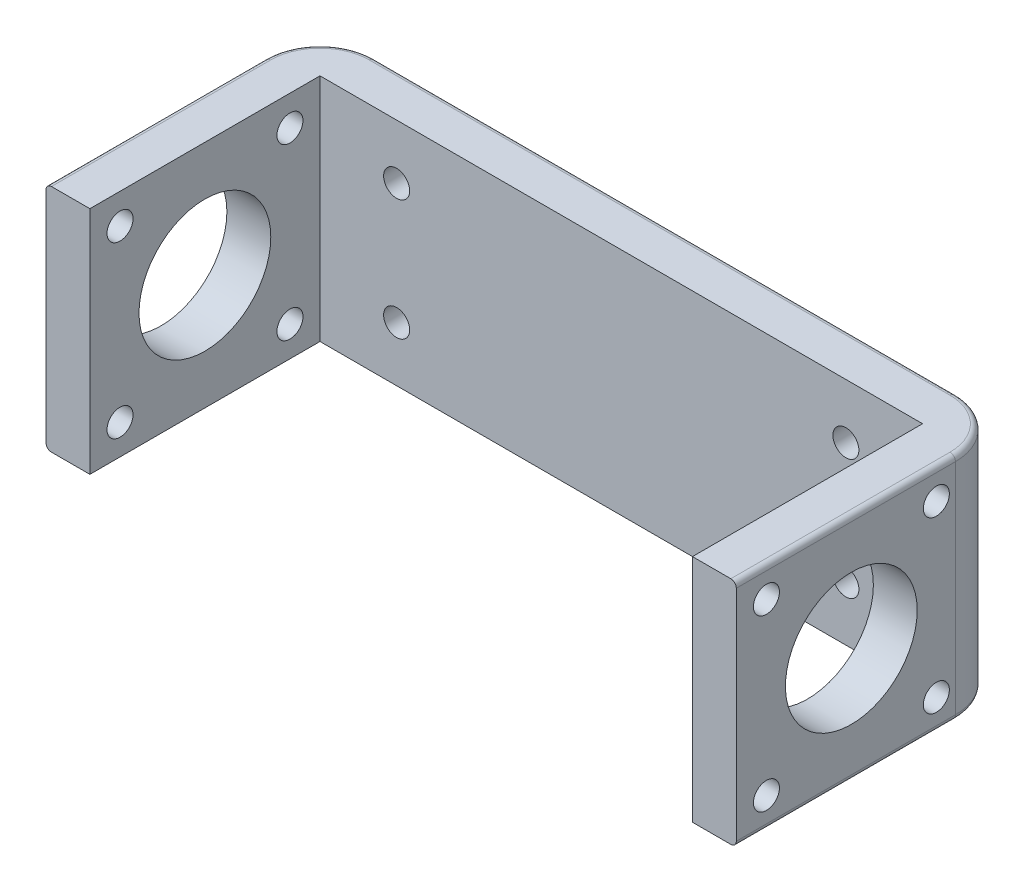
ISO-10303-21;
HEADER;
FILE_DESCRIPTION(('STEP AP214'),'2;1');
FILE_NAME('part.step','',(''),(''),'','','');
FILE_SCHEMA(('AUTOMOTIVE_DESIGN { 1 0 10303 214 1 1 1 1 }'));
ENDSEC;
DATA;
#1=APPLICATION_CONTEXT('core data for automotive mechanical design processes');
#2=APPLICATION_PROTOCOL_DEFINITION('international standard','automotive_design',2000,#1);
#3=PRODUCT_CONTEXT('',#1,'mechanical');
#4=PRODUCT('Part','Part','',(#3));
#5=PRODUCT_RELATED_PRODUCT_CATEGORY('part','',(#4));
#6=PRODUCT_DEFINITION_FORMATION('','',#4);
#7=PRODUCT_DEFINITION_CONTEXT('part definition',#1,'design');
#8=PRODUCT_DEFINITION('design','',#6,#7);
#9=PRODUCT_DEFINITION_SHAPE('','',#8);
#10=(LENGTH_UNIT() NAMED_UNIT(*) SI_UNIT(.MILLI.,.METRE.));
#11=(NAMED_UNIT(*) PLANE_ANGLE_UNIT() SI_UNIT($,.RADIAN.));
#12=(NAMED_UNIT(*) SI_UNIT($,.STERADIAN.) SOLID_ANGLE_UNIT());
#13=UNCERTAINTY_MEASURE_WITH_UNIT(LENGTH_MEASURE(1.E-05),#10,'distance_accuracy_value','');
#14=(GEOMETRIC_REPRESENTATION_CONTEXT(3) GLOBAL_UNCERTAINTY_ASSIGNED_CONTEXT((#13)) GLOBAL_UNIT_ASSIGNED_CONTEXT((#10,
#11,#12)) REPRESENTATION_CONTEXT('',''));
#15=CARTESIAN_POINT('',(0.,0.,0.));
#16=DIRECTION('',(0.,0.,1.));
#17=DIRECTION('',(1.,0.,0.));
#18=AXIS2_PLACEMENT_3D('',#15,#16,#17);
#19=CARTESIAN_POINT('',(0.,0.,8.));
#20=DIRECTION('',(0.,0.,1.));
#21=DIRECTION('',(1.,0.,0.));
#22=AXIS2_PLACEMENT_3D('',#19,#20,#21);
#23=PLANE('',#22);
#24=CARTESIAN_POINT('',(58.972972972973,-14.9328111570135,8.));
#25=DIRECTION('',(0.,0.,1.));
#26=DIRECTION('',(1.,0.,0.));
#27=AXIS2_PLACEMENT_3D('',#24,#25,#26);
#28=CIRCLE('',#27,2.375);
#29=CARTESIAN_POINT('',(61.347972972973,-14.9328111570135,8.));
#30=VERTEX_POINT('',#29);
#31=EDGE_CURVE('E284',#30,#30,#28,.T.);
#32=ORIENTED_EDGE('',*,*,#31,.F.);
#33=EDGE_LOOP('',(#32));
#34=FACE_BOUND('',#33,.T.);
#35=CARTESIAN_POINT('',(-23.027027027027,7.06718884298652,8.));
#36=DIRECTION('',(0.,0.,1.));
#37=DIRECTION('',(1.,0.,0.));
#38=AXIS2_PLACEMENT_3D('',#35,#36,#37);
#39=CIRCLE('',#38,2.375);
#40=CARTESIAN_POINT('',(-20.652027027027,7.06718884298652,8.));
#41=VERTEX_POINT('',#40);
#42=EDGE_CURVE('E329',#41,#41,#39,.T.);
#43=ORIENTED_EDGE('',*,*,#42,.F.);
#44=EDGE_LOOP('',(#43));
#45=FACE_BOUND('',#44,.T.);
#46=CARTESIAN_POINT('',(-23.027027027027,-14.9328111570135,8.));
#47=DIRECTION('',(0.,0.,1.));
#48=DIRECTION('',(1.,0.,0.));
#49=AXIS2_PLACEMENT_3D('',#46,#47,#48);
#50=CIRCLE('',#49,2.375);
#51=CARTESIAN_POINT('',(-20.652027027027,-14.9328111570135,8.));
#52=VERTEX_POINT('',#51);
#53=EDGE_CURVE('E332',#52,#52,#50,.T.);
#54=ORIENTED_EDGE('',*,*,#53,.F.);
#55=EDGE_LOOP('',(#54));
#56=FACE_BOUND('',#55,.T.);
#57=CARTESIAN_POINT('',(58.972972972973,7.06718884298652,8.));
#58=DIRECTION('',(0.,0.,1.));
#59=DIRECTION('',(1.,0.,0.));
#60=AXIS2_PLACEMENT_3D('',#57,#58,#59);
#61=CIRCLE('',#60,2.375);
#62=CARTESIAN_POINT('',(61.347972972973,7.06718884298652,8.));
#63=VERTEX_POINT('',#62);
#64=EDGE_CURVE('E335',#63,#63,#61,.T.);
#65=ORIENTED_EDGE('',*,*,#64,.F.);
#66=EDGE_LOOP('',(#65));
#67=FACE_BOUND('',#66,.T.);
#68=DIRECTION('',(1.,0.,0.));
#69=VECTOR('',#68,1.);
#70=CARTESIAN_POINT('',(-45.027027027027,-24.9328111570135,8.));
#71=LINE('',#70,#69);
#72=CARTESIAN_POINT('',(-37.0165416424409,-24.9328111570135,8.));
#73=VERTEX_POINT('',#72);
#74=CARTESIAN_POINT('',(72.972972972973,-24.9328111570135,8.));
#75=VERTEX_POINT('',#74);
#76=EDGE_CURVE('E204',#73,#75,#71,.T.);
#77=ORIENTED_EDGE('',*,*,#76,.T.);
#78=DIRECTION('',(0.,-1.,0.));
#79=VECTOR('',#78,1.);
#80=CARTESIAN_POINT('',(72.972972972973,17.0671888429865,8.));
#81=LINE('',#80,#79);
#82=CARTESIAN_POINT('',(72.972972972973,17.0671888429865,8.));
#83=VERTEX_POINT('',#82);
#84=EDGE_CURVE('E172',#83,#75,#81,.T.);
#85=ORIENTED_EDGE('',*,*,#84,.F.);
#86=DIRECTION('',(1.,0.,0.));
#87=VECTOR('',#86,1.);
#88=CARTESIAN_POINT('',(-45.027027027027,17.0671888429865,8.));
#89=LINE('',#88,#87);
#90=CARTESIAN_POINT('',(-37.0165416424409,17.0671888429865,8.));
#91=VERTEX_POINT('',#90);
#92=EDGE_CURVE('E206',#91,#83,#89,.T.);
#93=ORIENTED_EDGE('',*,*,#92,.F.);
#94=DIRECTION('',(0.,1.,0.));
#95=VECTOR('',#94,1.);
#96=CARTESIAN_POINT('',(-37.0165416424409,17.0671888429865,8.));
#97=LINE('',#96,#95);
#98=EDGE_CURVE('E189',#73,#91,#97,.T.);
#99=ORIENTED_EDGE('',*,*,#98,.F.);
#100=EDGE_LOOP('',(#77,#85,#93,#99));
#101=FACE_BOUND('',#100,.T.);
#102=ADVANCED_FACE('F39',(#34,#45,#56,#67,#101),#23,.T.);
#103=CARTESIAN_POINT('',(72.972972972973,17.0671888429865,50.));
#104=DIRECTION('',(1.,0.,0.));
#105=DIRECTION('',(0.,0.,-1.));
#106=AXIS2_PLACEMENT_3D('',#103,#104,#105);
#107=PLANE('',#106);
#108=CARTESIAN_POINT('',(72.972972972973,11.5686045141945,44.4991581311484));
#109=DIRECTION('',(1.,0.,0.));
#110=DIRECTION('',(0.,0.,-1.));
#111=AXIS2_PLACEMENT_3D('',#108,#109,#110);
#112=CIRCLE('',#111,2.375);
#113=CARTESIAN_POINT('',(72.972972972973,11.5686045141945,42.1241581311484));
#114=VERTEX_POINT('',#113);
#115=EDGE_CURVE('E350',#114,#114,#112,.T.);
#116=ORIENTED_EDGE('',*,*,#115,.T.);
#117=EDGE_LOOP('',(#116));
#118=FACE_BOUND('',#117,.T.);
#119=CARTESIAN_POINT('',(72.972972972973,-19.4342268282215,13.4835980335598));
#120=DIRECTION('',(1.,0.,0.));
#121=DIRECTION('',(0.,0.,-1.));
#122=AXIS2_PLACEMENT_3D('',#119,#120,#121);
#123=CIRCLE('',#122,2.375);
#124=CARTESIAN_POINT('',(72.972972972973,-19.4342268282215,11.1085980335599));
#125=VERTEX_POINT('',#124);
#126=EDGE_CURVE('E356',#125,#125,#123,.T.);
#127=ORIENTED_EDGE('',*,*,#126,.T.);
#128=EDGE_LOOP('',(#127));
#129=FACE_BOUND('',#128,.T.);
#130=CARTESIAN_POINT('',(72.972972972973,-19.4342268282215,44.4991581311484));
#131=DIRECTION('',(1.,0.,0.));
#132=DIRECTION('',(0.,0.,-1.));
#133=AXIS2_PLACEMENT_3D('',#130,#131,#132);
#134=CIRCLE('',#133,2.375);
#135=CARTESIAN_POINT('',(72.972972972973,-19.4342268282215,42.1241581311484));
#136=VERTEX_POINT('',#135);
#137=EDGE_CURVE('E362',#136,#136,#134,.T.);
#138=ORIENTED_EDGE('',*,*,#137,.T.);
#139=EDGE_LOOP('',(#138));
#140=FACE_BOUND('',#139,.T.);
#141=CARTESIAN_POINT('',(72.972972972973,11.5686045141945,13.4835980335598));
#142=DIRECTION('',(1.,0.,0.));
#143=DIRECTION('',(0.,0.,-1.));
#144=AXIS2_PLACEMENT_3D('',#141,#142,#143);
#145=CIRCLE('',#144,2.375);
#146=CARTESIAN_POINT('',(72.972972972973,11.5686045141945,11.1085980335599));
#147=VERTEX_POINT('',#146);
#148=EDGE_CURVE('E368',#147,#147,#145,.T.);
#149=ORIENTED_EDGE('',*,*,#148,.T.);
#150=EDGE_LOOP('',(#149));
#151=FACE_BOUND('',#150,.T.);
#152=CARTESIAN_POINT('',(72.972972972973,-3.93281115701345,29.0089279594518));
#153=DIRECTION('',(1.,0.,0.));
#154=DIRECTION('',(0.,0.,-1.));
#155=AXIS2_PLACEMENT_3D('',#152,#153,#154);
#156=CIRCLE('',#155,12.0274866063746);
#157=CARTESIAN_POINT('',(72.972972972973,-3.93281115701345,16.9814413530772));
#158=VERTEX_POINT('',#157);
#159=EDGE_CURVE('E210',#158,#158,#156,.T.);
#160=ORIENTED_EDGE('',*,*,#159,.T.);
#161=EDGE_LOOP('',(#160));
#162=FACE_BOUND('',#161,.T.);
#163=ORIENTED_EDGE('',*,*,#84,.T.);
#164=DIRECTION('',(0.,0.,-1.));
#165=VECTOR('',#164,1.);
#166=CARTESIAN_POINT('',(72.972972972973,-24.9328111570135,50.));
#167=LINE('',#166,#165);
#168=CARTESIAN_POINT('',(72.972972972973,-24.9328111570135,50.));
#169=VERTEX_POINT('',#168);
#170=EDGE_CURVE('E170',#169,#75,#167,.T.);
#171=ORIENTED_EDGE('',*,*,#170,.F.);
#172=DIRECTION('',(0.,-1.,0.));
#173=VECTOR('',#172,1.);
#174=CARTESIAN_POINT('',(72.972972972973,17.0671888429865,50.));
#175=LINE('',#174,#173);
#176=CARTESIAN_POINT('',(72.972972972973,17.0671888429865,50.));
#177=VERTEX_POINT('',#176);
#178=EDGE_CURVE('E155',#177,#169,#175,.T.);
#179=ORIENTED_EDGE('',*,*,#178,.F.);
#180=DIRECTION('',(0.,0.,-1.));
#181=VECTOR('',#180,1.);
#182=CARTESIAN_POINT('',(72.972972972973,17.0671888429865,50.));
#183=LINE('',#182,#181);
#184=EDGE_CURVE('E174',#177,#83,#183,.T.);
#185=ORIENTED_EDGE('',*,*,#184,.T.);
#186=EDGE_LOOP('',(#163,#171,#179,#185));
#187=FACE_BOUND('',#186,.T.);
#188=ADVANCED_FACE('F171',(#118,#129,#140,#151,#162,#187),#107,.F.);
#189=CARTESIAN_POINT('',(-37.0165416424409,17.0671888429865,50.));
#190=DIRECTION('',(-1.,0.,0.));
#191=DIRECTION('',(0.,0.,1.));
#192=AXIS2_PLACEMENT_3D('',#189,#190,#191);
#193=PLANE('',#192);
#194=CARTESIAN_POINT('',(-37.0165416424409,11.5686045141945,44.4991581311484));
#195=DIRECTION('',(-1.,0.,0.));
#196=DIRECTION('',(0.,0.,1.));
#197=AXIS2_PLACEMENT_3D('',#194,#195,#196);
#198=CIRCLE('',#197,2.375);
#199=CARTESIAN_POINT('',(-37.0165416424409,11.5686045141945,46.8741581311484));
#200=VERTEX_POINT('',#199);
#201=EDGE_CURVE('E353',#200,#200,#198,.T.);
#202=ORIENTED_EDGE('',*,*,#201,.T.);
#203=EDGE_LOOP('',(#202));
#204=FACE_BOUND('',#203,.T.);
#205=CARTESIAN_POINT('',(-37.0165416424409,-19.4342268282215,13.4835980335598));
#206=DIRECTION('',(-1.,0.,0.));
#207=DIRECTION('',(0.,0.,1.));
#208=AXIS2_PLACEMENT_3D('',#205,#206,#207);
#209=CIRCLE('',#208,2.375);
#210=CARTESIAN_POINT('',(-37.0165416424409,-19.4342268282215,15.8585980335598));
#211=VERTEX_POINT('',#210);
#212=EDGE_CURVE('E359',#211,#211,#209,.T.);
#213=ORIENTED_EDGE('',*,*,#212,.T.);
#214=EDGE_LOOP('',(#213));
#215=FACE_BOUND('',#214,.T.);
#216=CARTESIAN_POINT('',(-37.0165416424409,-19.4342268282215,44.4991581311484));
#217=DIRECTION('',(-1.,0.,0.));
#218=DIRECTION('',(0.,0.,1.));
#219=AXIS2_PLACEMENT_3D('',#216,#217,#218);
#220=CIRCLE('',#219,2.375);
#221=CARTESIAN_POINT('',(-37.0165416424409,-19.4342268282215,46.8741581311484));
#222=VERTEX_POINT('',#221);
#223=EDGE_CURVE('E365',#222,#222,#220,.T.);
#224=ORIENTED_EDGE('',*,*,#223,.T.);
#225=EDGE_LOOP('',(#224));
#226=FACE_BOUND('',#225,.T.);
#227=CARTESIAN_POINT('',(-37.0165416424409,11.5686045141945,13.4835980335598));
#228=DIRECTION('',(-1.,0.,0.));
#229=DIRECTION('',(0.,0.,1.));
#230=AXIS2_PLACEMENT_3D('',#227,#228,#229);
#231=CIRCLE('',#230,2.375);
#232=CARTESIAN_POINT('',(-37.0165416424409,11.5686045141945,15.8585980335598));
#233=VERTEX_POINT('',#232);
#234=EDGE_CURVE('E371',#233,#233,#231,.T.);
#235=ORIENTED_EDGE('',*,*,#234,.T.);
#236=EDGE_LOOP('',(#235));
#237=FACE_BOUND('',#236,.T.);
#238=CARTESIAN_POINT('',(-37.0165416424409,-3.93281115701345,29.0089279594518));
#239=DIRECTION('',(-1.,0.,0.));
#240=DIRECTION('',(0.,0.,1.));
#241=AXIS2_PLACEMENT_3D('',#238,#239,#240);
#242=CIRCLE('',#241,12.0274866063746);
#243=CARTESIAN_POINT('',(-37.0165416424409,-3.93281115701345,41.0364145658263));
#244=VERTEX_POINT('',#243);
#245=EDGE_CURVE('E213',#244,#244,#242,.T.);
#246=ORIENTED_EDGE('',*,*,#245,.T.);
#247=EDGE_LOOP('',(#246));
#248=FACE_BOUND('',#247,.T.);
#249=ORIENTED_EDGE('',*,*,#98,.T.);
#250=DIRECTION('',(0.,0.,-1.));
#251=VECTOR('',#250,1.);
#252=CARTESIAN_POINT('',(-37.0165416424409,17.0671888429865,50.));
#253=LINE('',#252,#251);
#254=CARTESIAN_POINT('',(-37.0165416424409,17.0671888429865,50.));
#255=VERTEX_POINT('',#254);
#256=EDGE_CURVE('E196',#255,#91,#253,.T.);
#257=ORIENTED_EDGE('',*,*,#256,.F.);
#258=DIRECTION('',(0.,1.,0.));
#259=VECTOR('',#258,1.);
#260=CARTESIAN_POINT('',(-37.0165416424409,17.0671888429865,50.));
#261=LINE('',#260,#259);
#262=CARTESIAN_POINT('',(-37.0165416424409,-24.9328111570135,50.));
#263=VERTEX_POINT('',#262);
#264=EDGE_CURVE('E191',#263,#255,#261,.T.);
#265=ORIENTED_EDGE('',*,*,#264,.F.);
#266=DIRECTION('',(0.,0.,-1.));
#267=VECTOR('',#266,1.);
#268=CARTESIAN_POINT('',(-37.0165416424409,-24.9328111570135,50.));
#269=LINE('',#268,#267);
#270=EDGE_CURVE('E201',#263,#73,#269,.T.);
#271=ORIENTED_EDGE('',*,*,#270,.T.);
#272=EDGE_LOOP('',(#249,#257,#265,#271));
#273=FACE_BOUND('',#272,.T.);
#274=ADVANCED_FACE('F405',(#204,#215,#226,#237,#248,#273),#193,.F.);
#275=CARTESIAN_POINT('',(-45.027027027027,17.0671888429865,8.));
#276=DIRECTION('',(1.,0.,0.));
#277=DIRECTION('',(0.,0.,-1.));
#278=AXIS2_PLACEMENT_3D('',#275,#276,#277);
#279=PLANE('',#278);
#280=CARTESIAN_POINT('',(-45.027027027027,11.5686045141945,44.4991581311484));
#281=DIRECTION('',(-1.,0.,0.));
#282=DIRECTION('',(0.,0.,1.));
#283=AXIS2_PLACEMENT_3D('',#280,#281,#282);
#284=CIRCLE('',#283,2.375);
#285=CARTESIAN_POINT('',(-45.027027027027,11.5686045141945,46.8741581311484));
#286=VERTEX_POINT('',#285);
#287=EDGE_CURVE('E378',#286,#286,#284,.T.);
#288=ORIENTED_EDGE('',*,*,#287,.F.);
#289=EDGE_LOOP('',(#288));
#290=FACE_BOUND('',#289,.T.);
#291=CARTESIAN_POINT('',(-45.027027027027,-19.4342268282215,13.4835980335598));
#292=DIRECTION('',(-1.,0.,0.));
#293=DIRECTION('',(0.,0.,1.));
#294=AXIS2_PLACEMENT_3D('',#291,#292,#293);
#295=CIRCLE('',#294,2.375);
#296=CARTESIAN_POINT('',(-45.027027027027,-19.4342268282215,15.8585980335598));
#297=VERTEX_POINT('',#296);
#298=EDGE_CURVE('E384',#297,#297,#295,.T.);
#299=ORIENTED_EDGE('',*,*,#298,.F.);
#300=EDGE_LOOP('',(#299));
#301=FACE_BOUND('',#300,.T.);
#302=CARTESIAN_POINT('',(-45.027027027027,-19.4342268282215,44.4991581311484));
#303=DIRECTION('',(-1.,0.,0.));
#304=DIRECTION('',(0.,0.,1.));
#305=AXIS2_PLACEMENT_3D('',#302,#303,#304);
#306=CIRCLE('',#305,2.375);
#307=CARTESIAN_POINT('',(-45.027027027027,-19.4342268282215,46.8741581311484));
#308=VERTEX_POINT('',#307);
#309=EDGE_CURVE('E385',#308,#308,#306,.T.);
#310=ORIENTED_EDGE('',*,*,#309,.F.);
#311=EDGE_LOOP('',(#310));
#312=FACE_BOUND('',#311,.T.);
#313=CARTESIAN_POINT('',(-45.027027027027,11.5686045141945,13.4835980335598));
#314=DIRECTION('',(-1.,0.,0.));
#315=DIRECTION('',(0.,0.,1.));
#316=AXIS2_PLACEMENT_3D('',#313,#314,#315);
#317=CIRCLE('',#316,2.375);
#318=CARTESIAN_POINT('',(-45.027027027027,11.5686045141945,15.8585980335598));
#319=VERTEX_POINT('',#318);
#320=EDGE_CURVE('E375',#319,#319,#317,.T.);
#321=ORIENTED_EDGE('',*,*,#320,.F.);
#322=EDGE_LOOP('',(#321));
#323=FACE_BOUND('',#322,.T.);
#324=CARTESIAN_POINT('',(-45.027027027027,-3.93281115701345,29.0089279594518));
#325=DIRECTION('',(1.,0.,0.));
#326=DIRECTION('',(0.,0.,-1.));
#327=AXIS2_PLACEMENT_3D('',#324,#325,#326);
#328=CIRCLE('',#327,12.0274866063746);
#329=CARTESIAN_POINT('',(-45.027027027027,-3.93281115701345,16.9814413530772));
#330=VERTEX_POINT('',#329);
#331=EDGE_CURVE('E214',#330,#330,#328,.T.);
#332=ORIENTED_EDGE('',*,*,#331,.T.);
#333=EDGE_LOOP('',(#332));
#334=FACE_BOUND('',#333,.T.);
#335=DIRECTION('',(0.,-1.,0.));
#336=VECTOR('',#335,1.);
#337=CARTESIAN_POINT('',(-45.027027027027,17.0671888429865,50.));
#338=LINE('',#337,#336);
#339=CARTESIAN_POINT('',(-45.027027027027,16.0671888429865,50.));
#340=VERTEX_POINT('',#339);
#341=CARTESIAN_POINT('',(-45.027027027027,-23.9328111570135,50.));
#342=VERTEX_POINT('',#341);
#343=EDGE_CURVE('E185',#340,#342,#338,.T.);
#344=ORIENTED_EDGE('',*,*,#343,.F.);
#345=DIRECTION('',(0.,0.,-1.));
#346=VECTOR('',#345,1.);
#347=CARTESIAN_POINT('',(-45.027027027027,16.0671888429865,10.));
#348=LINE('',#347,#346);
#349=CARTESIAN_POINT('',(-45.027027027027,16.0671888429865,10.));
#350=VERTEX_POINT('',#349);
#351=EDGE_CURVE('E228',#340,#350,#348,.T.);
#352=ORIENTED_EDGE('',*,*,#351,.T.);
#353=DIRECTION('',(0.,-1.,0.));
#354=VECTOR('',#353,1.);
#355=CARTESIAN_POINT('',(-45.027027027027,17.0671888429865,10.));
#356=LINE('',#355,#354);
#357=CARTESIAN_POINT('',(-45.027027027027,-23.9328111570135,10.));
#358=VERTEX_POINT('',#357);
#359=EDGE_CURVE('E220',#350,#358,#356,.T.);
#360=ORIENTED_EDGE('',*,*,#359,.T.);
#361=DIRECTION('',(0.,0.,-1.));
#362=VECTOR('',#361,1.);
#363=CARTESIAN_POINT('',(-45.027027027027,-23.9328111570135,8.));
#364=LINE('',#363,#362);
#365=EDGE_CURVE('E226',#358,#342,#364,.F.);
#366=ORIENTED_EDGE('',*,*,#365,.T.);
#367=EDGE_LOOP('',(#344,#352,#360,#366));
#368=FACE_BOUND('',#367,.T.);
#369=ADVANCED_FACE('F402',(#290,#301,#312,#323,#334,#368),#279,.F.);
#370=CARTESIAN_POINT('',(-45.027027027027,-24.9328111570135,8.));
#371=DIRECTION('',(0.,1.,0.));
#372=DIRECTION('',(0.,0.,1.));
#373=AXIS2_PLACEMENT_3D('',#370,#371,#372);
#374=PLANE('',#373);
#375=DIRECTION('',(1.,0.,0.));
#376=VECTOR('',#375,1.);
#377=CARTESIAN_POINT('',(-45.027027027027,-24.9328111570135,50.));
#378=LINE('',#377,#376);
#379=CARTESIAN_POINT('',(-44.027027027027,-24.9328111570135,50.));
#380=VERTEX_POINT('',#379);
#381=EDGE_CURVE('E188',#380,#263,#378,.T.);
#382=ORIENTED_EDGE('',*,*,#381,.F.);
#383=DIRECTION('',(0.,0.,-1.));
#384=VECTOR('',#383,1.);
#385=CARTESIAN_POINT('',(-44.027027027027,-24.9328111570135,8.));
#386=LINE('',#385,#384);
#387=CARTESIAN_POINT('',(-44.027027027027,-24.9328111570135,10.));
#388=VERTEX_POINT('',#387);
#389=EDGE_CURVE('E267',#380,#388,#386,.T.);
#390=ORIENTED_EDGE('',*,*,#389,.T.);
#391=CARTESIAN_POINT('',(-35.027027027027,-24.9328111570135,10.));
#392=DIRECTION('',(0.,1.,0.));
#393=DIRECTION('',(0.,0.,1.));
#394=AXIS2_PLACEMENT_3D('',#391,#392,#393);
#395=CIRCLE('',#394,9.);
#396=CARTESIAN_POINT('',(-35.027027027027,-24.9328111570135,1.));
#397=VERTEX_POINT('',#396);
#398=EDGE_CURVE('E265',#388,#397,#395,.F.);
#399=ORIENTED_EDGE('',*,*,#398,.T.);
#400=DIRECTION('',(1.,0.,0.));
#401=VECTOR('',#400,1.);
#402=CARTESIAN_POINT('',(-45.027027027027,-24.9328111570135,1.));
#403=LINE('',#402,#401);
#404=CARTESIAN_POINT('',(70.972972972973,-24.9328111570135,1.));
#405=VERTEX_POINT('',#404);
#406=EDGE_CURVE('E261',#397,#405,#403,.T.);
#407=ORIENTED_EDGE('',*,*,#406,.T.);
#408=CARTESIAN_POINT('',(70.972972972973,-24.9328111570135,10.));
#409=DIRECTION('',(0.,1.,0.));
#410=DIRECTION('',(0.,0.,1.));
#411=AXIS2_PLACEMENT_3D('',#408,#409,#410);
#412=CIRCLE('',#411,9.);
#413=CARTESIAN_POINT('',(79.972972972973,-24.9328111570135,10.));
#414=VERTEX_POINT('',#413);
#415=EDGE_CURVE('E64',#405,#414,#412,.F.);
#416=ORIENTED_EDGE('',*,*,#415,.T.);
#417=DIRECTION('',(0.,0.,-1.));
#418=VECTOR('',#417,1.);
#419=CARTESIAN_POINT('',(79.972972972973,-24.9328111570135,50.));
#420=LINE('',#419,#418);
#421=CARTESIAN_POINT('',(79.972972972973,-24.9328111570135,50.));
#422=VERTEX_POINT('',#421);
#423=EDGE_CURVE('E178',#414,#422,#420,.F.);
#424=ORIENTED_EDGE('',*,*,#423,.T.);
#425=DIRECTION('',(1.,0.,0.));
#426=VECTOR('',#425,1.);
#427=CARTESIAN_POINT('',(80.972972972973,-24.9328111570135,50.));
#428=LINE('',#427,#426);
#429=EDGE_CURVE('E160',#169,#422,#428,.T.);
#430=ORIENTED_EDGE('',*,*,#429,.F.);
#431=ORIENTED_EDGE('',*,*,#170,.T.);
#432=ORIENTED_EDGE('',*,*,#76,.F.);
#433=ORIENTED_EDGE('',*,*,#270,.F.);
#434=EDGE_LOOP('',(#382,#390,#399,#407,#416,#424,#430,#431,#432,#433));
#435=FACE_BOUND('',#434,.T.);
#436=ADVANCED_FACE('F177',(#435),#374,.F.);
#437=CARTESIAN_POINT('',(80.972972972973,17.0671888429865,8.));
#438=DIRECTION('',(1.,0.,0.));
#439=DIRECTION('',(0.,1.,0.));
#440=AXIS2_PLACEMENT_3D('',#437,#438,#439);
#441=PLANE('',#440);
#442=CARTESIAN_POINT('',(80.972972972973,11.5686045141945,44.4991581311484));
#443=DIRECTION('',(-1.,0.,0.));
#444=DIRECTION('',(0.,0.,1.));
#445=AXIS2_PLACEMENT_3D('',#442,#443,#444);
#446=CIRCLE('',#445,2.375);
#447=CARTESIAN_POINT('',(80.972972972973,11.5686045141945,46.8741581311484));
#448=VERTEX_POINT('',#447);
#449=EDGE_CURVE('E388',#448,#448,#446,.T.);
#450=ORIENTED_EDGE('',*,*,#449,.T.);
#451=EDGE_LOOP('',(#450));
#452=FACE_BOUND('',#451,.T.);
#453=CARTESIAN_POINT('',(80.972972972973,-19.4342268282215,13.4835980335598));
#454=DIRECTION('',(-1.,0.,0.));
#455=DIRECTION('',(0.,0.,1.));
#456=AXIS2_PLACEMENT_3D('',#453,#454,#455);
#457=CIRCLE('',#456,2.375);
#458=CARTESIAN_POINT('',(80.972972972973,-19.4342268282215,15.8585980335598));
#459=VERTEX_POINT('',#458);
#460=EDGE_CURVE('E381',#459,#459,#457,.T.);
#461=ORIENTED_EDGE('',*,*,#460,.T.);
#462=EDGE_LOOP('',(#461));
#463=FACE_BOUND('',#462,.T.);
#464=CARTESIAN_POINT('',(80.972972972973,-19.4342268282215,44.4991581311484));
#465=DIRECTION('',(-1.,0.,0.));
#466=DIRECTION('',(0.,0.,1.));
#467=AXIS2_PLACEMENT_3D('',#464,#465,#466);
#468=CIRCLE('',#467,2.375);
#469=CARTESIAN_POINT('',(80.972972972973,-19.4342268282215,46.8741581311484));
#470=VERTEX_POINT('',#469);
#471=EDGE_CURVE('E393',#470,#470,#468,.T.);
#472=ORIENTED_EDGE('',*,*,#471,.T.);
#473=EDGE_LOOP('',(#472));
#474=FACE_BOUND('',#473,.T.);
#475=CARTESIAN_POINT('',(80.972972972973,11.5686045141945,13.4835980335598));
#476=DIRECTION('',(-1.,0.,0.));
#477=DIRECTION('',(0.,0.,1.));
#478=AXIS2_PLACEMENT_3D('',#475,#476,#477);
#479=CIRCLE('',#478,2.375);
#480=CARTESIAN_POINT('',(80.972972972973,11.5686045141945,15.8585980335598));
#481=VERTEX_POINT('',#480);
#482=EDGE_CURVE('E374',#481,#481,#479,.T.);
#483=ORIENTED_EDGE('',*,*,#482,.T.);
#484=EDGE_LOOP('',(#483));
#485=FACE_BOUND('',#484,.T.);
#486=CARTESIAN_POINT('',(80.972972972973,-3.93281115701345,29.0089279594518));
#487=DIRECTION('',(1.,0.,0.));
#488=DIRECTION('',(0.,1.,0.));
#489=AXIS2_PLACEMENT_3D('',#486,#487,#488);
#490=CIRCLE('',#489,12.0274866063746);
#491=CARTESIAN_POINT('',(80.972972972973,8.09467544936112,29.0089279594518));
#492=VERTEX_POINT('',#491);
#493=EDGE_CURVE('E318',#492,#492,#490,.T.);
#494=ORIENTED_EDGE('',*,*,#493,.F.);
#495=EDGE_LOOP('',(#494));
#496=FACE_BOUND('',#495,.T.);
#497=DIRECTION('',(0.,-1.,0.));
#498=VECTOR('',#497,1.);
#499=CARTESIAN_POINT('',(80.972972972973,17.0671888429865,10.));
#500=LINE('',#499,#498);
#501=CARTESIAN_POINT('',(80.972972972973,-23.9328111570135,10.));
#502=VERTEX_POINT('',#501);
#503=CARTESIAN_POINT('',(80.972972972973,16.0671888429865,10.));
#504=VERTEX_POINT('',#503);
#505=EDGE_CURVE('E217',#502,#504,#500,.F.);
#506=ORIENTED_EDGE('',*,*,#505,.T.);
#507=DIRECTION('',(0.,0.,-1.));
#508=VECTOR('',#507,1.);
#509=CARTESIAN_POINT('',(80.972972972973,16.0671888429865,8.));
#510=LINE('',#509,#508);
#511=CARTESIAN_POINT('',(80.972972972973,16.0671888429865,50.));
#512=VERTEX_POINT('',#511);
#513=EDGE_CURVE('E251',#504,#512,#510,.F.);
#514=ORIENTED_EDGE('',*,*,#513,.T.);
#515=DIRECTION('',(0.,1.,0.));
#516=VECTOR('',#515,1.);
#517=CARTESIAN_POINT('',(80.972972972973,17.0671888429865,50.));
#518=LINE('',#517,#516);
#519=CARTESIAN_POINT('',(80.972972972973,-23.9328111570135,50.));
#520=VERTEX_POINT('',#519);
#521=EDGE_CURVE('E183',#520,#512,#518,.T.);
#522=ORIENTED_EDGE('',*,*,#521,.F.);
#523=DIRECTION('',(0.,0.,-1.));
#524=VECTOR('',#523,1.);
#525=CARTESIAN_POINT('',(80.972972972973,-23.9328111570135,10.));
#526=LINE('',#525,#524);
#527=EDGE_CURVE('E249',#520,#502,#526,.T.);
#528=ORIENTED_EDGE('',*,*,#527,.T.);
#529=EDGE_LOOP('',(#506,#514,#522,#528));
#530=FACE_BOUND('',#529,.T.);
#531=ADVANCED_FACE('F302',(#452,#463,#474,#485,#496,#530),#441,.T.);
#532=CARTESIAN_POINT('',(-45.027027027027,17.0671888429865,8.));
#533=DIRECTION('',(0.,1.,0.));
#534=DIRECTION('',(0.,0.,1.));
#535=AXIS2_PLACEMENT_3D('',#532,#533,#534);
#536=PLANE('',#535);
#537=CARTESIAN_POINT('',(-35.027027027027,17.0671888429865,10.));
#538=DIRECTION('',(0.,1.,0.));
#539=DIRECTION('',(0.,0.,1.));
#540=AXIS2_PLACEMENT_3D('',#537,#538,#539);
#541=CIRCLE('',#540,9.);
#542=CARTESIAN_POINT('',(-35.027027027027,17.0671888429865,1.));
#543=VERTEX_POINT('',#542);
#544=CARTESIAN_POINT('',(-44.027027027027,17.0671888429865,10.));
#545=VERTEX_POINT('',#544);
#546=EDGE_CURVE('E237',#543,#545,#541,.T.);
#547=ORIENTED_EDGE('',*,*,#546,.T.);
#548=DIRECTION('',(0.,0.,-1.));
#549=VECTOR('',#548,1.);
#550=CARTESIAN_POINT('',(-44.027027027027,17.0671888429865,50.));
#551=LINE('',#550,#549);
#552=CARTESIAN_POINT('',(-44.027027027027,17.0671888429865,50.));
#553=VERTEX_POINT('',#552);
#554=EDGE_CURVE('E239',#545,#553,#551,.F.);
#555=ORIENTED_EDGE('',*,*,#554,.T.);
#556=DIRECTION('',(-1.,0.,0.));
#557=VECTOR('',#556,1.);
#558=CARTESIAN_POINT('',(-45.027027027027,17.0671888429865,50.));
#559=LINE('',#558,#557);
#560=EDGE_CURVE('E193',#255,#553,#559,.T.);
#561=ORIENTED_EDGE('',*,*,#560,.F.);
#562=ORIENTED_EDGE('',*,*,#256,.T.);
#563=ORIENTED_EDGE('',*,*,#92,.T.);
#564=ORIENTED_EDGE('',*,*,#184,.F.);
#565=DIRECTION('',(-1.,0.,0.));
#566=VECTOR('',#565,1.);
#567=CARTESIAN_POINT('',(80.972972972973,17.0671888429865,50.));
#568=LINE('',#567,#566);
#569=CARTESIAN_POINT('',(79.972972972973,17.0671888429865,50.));
#570=VERTEX_POINT('',#569);
#571=EDGE_CURVE('E163',#570,#177,#568,.T.);
#572=ORIENTED_EDGE('',*,*,#571,.F.);
#573=DIRECTION('',(0.,0.,-1.));
#574=VECTOR('',#573,1.);
#575=CARTESIAN_POINT('',(79.972972972973,17.0671888429865,8.));
#576=LINE('',#575,#574);
#577=CARTESIAN_POINT('',(79.972972972973,17.0671888429865,10.));
#578=VERTEX_POINT('',#577);
#579=EDGE_CURVE('E235',#570,#578,#576,.T.);
#580=ORIENTED_EDGE('',*,*,#579,.T.);
#581=CARTESIAN_POINT('',(70.972972972973,17.0671888429865,10.));
#582=DIRECTION('',(0.,1.,0.));
#583=DIRECTION('',(0.,0.,1.));
#584=AXIS2_PLACEMENT_3D('',#581,#582,#583);
#585=CIRCLE('',#584,9.);
#586=CARTESIAN_POINT('',(70.972972972973,17.0671888429865,1.));
#587=VERTEX_POINT('',#586);
#588=EDGE_CURVE('E233',#578,#587,#585,.T.);
#589=ORIENTED_EDGE('',*,*,#588,.T.);
#590=DIRECTION('',(1.,0.,0.));
#591=VECTOR('',#590,1.);
#592=CARTESIAN_POINT('',(-35.027027027027,17.0671888429865,1.));
#593=LINE('',#592,#591);
#594=EDGE_CURVE('E231',#587,#543,#593,.F.);
#595=ORIENTED_EDGE('',*,*,#594,.T.);
#596=EDGE_LOOP('',(#547,#555,#561,#562,#563,#564,#572,#580,#589,#595));
#597=FACE_BOUND('',#596,.T.);
#598=ADVANCED_FACE('F316',(#597),#536,.T.);
#599=CARTESIAN_POINT('',(0.,0.,0.));
#600=DIRECTION('',(0.,0.,1.));
#601=DIRECTION('',(1.,0.,0.));
#602=AXIS2_PLACEMENT_3D('',#599,#600,#601);
#603=PLANE('',#602);
#604=CARTESIAN_POINT('',(58.972972972973,-14.9328111570135,0.));
#605=DIRECTION('',(0.,0.,-1.));
#606=DIRECTION('',(-1.,0.,0.));
#607=AXIS2_PLACEMENT_3D('',#604,#605,#606);
#608=CIRCLE('',#607,2.375);
#609=CARTESIAN_POINT('',(56.597972972973,-14.9328111570135,0.));
#610=VERTEX_POINT('',#609);
#611=EDGE_CURVE('E341',#610,#610,#608,.T.);
#612=ORIENTED_EDGE('',*,*,#611,.F.);
#613=EDGE_LOOP('',(#612));
#614=FACE_BOUND('',#613,.T.);
#615=CARTESIAN_POINT('',(-23.027027027027,7.06718884298652,0.));
#616=DIRECTION('',(0.,0.,-1.));
#617=DIRECTION('',(-1.,0.,0.));
#618=AXIS2_PLACEMENT_3D('',#615,#616,#617);
#619=CIRCLE('',#618,2.375);
#620=CARTESIAN_POINT('',(-25.402027027027,7.06718884298652,0.));
#621=VERTEX_POINT('',#620);
#622=EDGE_CURVE('E342',#621,#621,#619,.T.);
#623=ORIENTED_EDGE('',*,*,#622,.F.);
#624=EDGE_LOOP('',(#623));
#625=FACE_BOUND('',#624,.T.);
#626=CARTESIAN_POINT('',(-23.027027027027,-14.9328111570135,0.));
#627=DIRECTION('',(0.,0.,-1.));
#628=DIRECTION('',(-1.,0.,0.));
#629=AXIS2_PLACEMENT_3D('',#626,#627,#628);
#630=CIRCLE('',#629,2.375);
#631=CARTESIAN_POINT('',(-25.402027027027,-14.9328111570135,0.));
#632=VERTEX_POINT('',#631);
#633=EDGE_CURVE('E345',#632,#632,#630,.T.);
#634=ORIENTED_EDGE('',*,*,#633,.F.);
#635=EDGE_LOOP('',(#634));
#636=FACE_BOUND('',#635,.T.);
#637=CARTESIAN_POINT('',(58.972972972973,7.06718884298652,0.));
#638=DIRECTION('',(0.,0.,-1.));
#639=DIRECTION('',(-1.,0.,0.));
#640=AXIS2_PLACEMENT_3D('',#637,#638,#639);
#641=CIRCLE('',#640,2.375);
#642=CARTESIAN_POINT('',(56.597972972973,7.06718884298652,0.));
#643=VERTEX_POINT('',#642);
#644=EDGE_CURVE('E338',#643,#643,#641,.T.);
#645=ORIENTED_EDGE('',*,*,#644,.F.);
#646=EDGE_LOOP('',(#645));
#647=FACE_BOUND('',#646,.T.);
#648=DIRECTION('',(0.,-1.,0.));
#649=VECTOR('',#648,1.);
#650=CARTESIAN_POINT('',(-35.027027027027,0.,0.));
#651=LINE('',#650,#649);
#652=CARTESIAN_POINT('',(-35.027027027027,-23.9328111570135,0.));
#653=VERTEX_POINT('',#652);
#654=CARTESIAN_POINT('',(-35.027027027027,16.0671888429865,0.));
#655=VERTEX_POINT('',#654);
#656=EDGE_CURVE('E223',#653,#655,#651,.F.);
#657=ORIENTED_EDGE('',*,*,#656,.T.);
#658=DIRECTION('',(1.,0.,0.));
#659=VECTOR('',#658,1.);
#660=CARTESIAN_POINT('',(70.972972972973,16.0671888429865,0.));
#661=LINE('',#660,#659);
#662=CARTESIAN_POINT('',(70.972972972973,16.0671888429865,0.));
#663=VERTEX_POINT('',#662);
#664=EDGE_CURVE('E11',#655,#663,#661,.T.);
#665=ORIENTED_EDGE('',*,*,#664,.T.);
#666=DIRECTION('',(0.,-1.,0.));
#667=VECTOR('',#666,1.);
#668=CARTESIAN_POINT('',(70.972972972973,-24.9328111570135,0.));
#669=LINE('',#668,#667);
#670=CARTESIAN_POINT('',(70.972972972973,-23.9328111570135,0.));
#671=VERTEX_POINT('',#670);
#672=EDGE_CURVE('E209',#663,#671,#669,.T.);
#673=ORIENTED_EDGE('',*,*,#672,.T.);
#674=DIRECTION('',(1.,0.,0.));
#675=VECTOR('',#674,1.);
#676=CARTESIAN_POINT('',(0.,-23.9328111570135,0.));
#677=LINE('',#676,#675);
#678=EDGE_CURVE('E48',#671,#653,#677,.F.);
#679=ORIENTED_EDGE('',*,*,#678,.T.);
#680=EDGE_LOOP('',(#657,#665,#673,#679));
#681=FACE_BOUND('',#680,.T.);
#682=ADVANCED_FACE('F432',(#614,#625,#636,#647,#681),#603,.F.);
#683=CARTESIAN_POINT('',(0.,0.,50.));
#684=DIRECTION('',(0.,0.,1.));
#685=DIRECTION('',(1.,0.,0.));
#686=AXIS2_PLACEMENT_3D('',#683,#684,#685);
#687=PLANE('',#686);
#688=ORIENTED_EDGE('',*,*,#560,.T.);
#689=CARTESIAN_POINT('',(-44.027027027027,16.0671888429865,50.));
#690=DIRECTION('',(0.,0.,1.));
#691=DIRECTION('',(1.,0.,0.));
#692=AXIS2_PLACEMENT_3D('',#689,#690,#691);
#693=CIRCLE('',#692,1.);
#694=EDGE_CURVE('E243',#553,#340,#693,.T.);
#695=ORIENTED_EDGE('',*,*,#694,.T.);
#696=ORIENTED_EDGE('',*,*,#343,.T.);
#697=CARTESIAN_POINT('',(-44.027027027027,-23.9328111570135,50.));
#698=DIRECTION('',(0.,0.,1.));
#699=DIRECTION('',(1.,0.,0.));
#700=AXIS2_PLACEMENT_3D('',#697,#698,#699);
#701=CIRCLE('',#700,1.);
#702=EDGE_CURVE('E241',#342,#380,#701,.T.);
#703=ORIENTED_EDGE('',*,*,#702,.T.);
#704=ORIENTED_EDGE('',*,*,#381,.T.);
#705=ORIENTED_EDGE('',*,*,#264,.T.);
#706=EDGE_LOOP('',(#688,#695,#696,#703,#704,#705));
#707=FACE_BOUND('',#706,.T.);
#708=ADVANCED_FACE('F437',(#707),#687,.T.);
#709=CARTESIAN_POINT('',(0.,0.,50.));
#710=DIRECTION('',(0.,0.,-1.));
#711=DIRECTION('',(-1.,0.,0.));
#712=AXIS2_PLACEMENT_3D('',#709,#710,#711);
#713=PLANE('',#712);
#714=ORIENTED_EDGE('',*,*,#521,.T.);
#715=CARTESIAN_POINT('',(79.972972972973,16.0671888429865,50.));
#716=DIRECTION('',(0.,0.,-1.));
#717=DIRECTION('',(-1.,0.,0.));
#718=AXIS2_PLACEMENT_3D('',#715,#716,#717);
#719=CIRCLE('',#718,1.);
#720=EDGE_CURVE('E255',#512,#570,#719,.F.);
#721=ORIENTED_EDGE('',*,*,#720,.T.);
#722=ORIENTED_EDGE('',*,*,#571,.T.);
#723=ORIENTED_EDGE('',*,*,#178,.T.);
#724=ORIENTED_EDGE('',*,*,#429,.T.);
#725=CARTESIAN_POINT('',(79.972972972973,-23.9328111570135,50.));
#726=DIRECTION('',(0.,0.,-1.));
#727=DIRECTION('',(-1.,0.,0.));
#728=AXIS2_PLACEMENT_3D('',#725,#726,#727);
#729=CIRCLE('',#728,1.);
#730=EDGE_CURVE('E253',#422,#520,#729,.F.);
#731=ORIENTED_EDGE('',*,*,#730,.T.);
#732=EDGE_LOOP('',(#714,#721,#722,#723,#724,#731));
#733=FACE_BOUND('',#732,.T.);
#734=ADVANCED_FACE('F158',(#733),#713,.F.);
#735=CARTESIAN_POINT('',(-45.027027027027,-3.93281115701345,29.0089279594518));
#736=DIRECTION('',(1.,0.,0.));
#737=DIRECTION('',(0.,0.,-1.));
#738=AXIS2_PLACEMENT_3D('',#735,#736,#737);
#739=CYLINDRICAL_SURFACE('',#738,12.0274866063746);
#740=ORIENTED_EDGE('',*,*,#493,.T.);
#741=EDGE_LOOP('',(#740));
#742=FACE_BOUND('',#741,.T.);
#743=ORIENTED_EDGE('',*,*,#159,.F.);
#744=EDGE_LOOP('',(#743));
#745=FACE_BOUND('',#744,.T.);
#746=ADVANCED_FACE('F514',(#742,#745),#739,.F.);
#747=ORIENTED_EDGE('',*,*,#331,.F.);
#748=EDGE_LOOP('',(#747));
#749=FACE_BOUND('',#748,.T.);
#750=ORIENTED_EDGE('',*,*,#245,.F.);
#751=EDGE_LOOP('',(#750));
#752=FACE_BOUND('',#751,.T.);
#753=ADVANCED_FACE('F482',(#749,#752),#739,.F.);
#754=CARTESIAN_POINT('',(70.972972972973,0.,10.));
#755=DIRECTION('',(0.,1.,0.));
#756=DIRECTION('',(-1.,0.,0.));
#757=AXIS2_PLACEMENT_3D('',#754,#755,#756);
#758=CYLINDRICAL_SURFACE('',#757,10.);
#759=ORIENTED_EDGE('',*,*,#672,.F.);
#760=CARTESIAN_POINT('',(70.972972972973,16.0671888429865,10.));
#761=DIRECTION('',(0.,1.,0.));
#762=DIRECTION('',(0.,0.,1.));
#763=AXIS2_PLACEMENT_3D('',#760,#761,#762);
#764=CIRCLE('',#763,10.);
#765=EDGE_CURVE('E259',#663,#504,#764,.F.);
#766=ORIENTED_EDGE('',*,*,#765,.T.);
#767=ORIENTED_EDGE('',*,*,#505,.F.);
#768=CARTESIAN_POINT('',(70.972972972973,-23.9328111570135,10.));
#769=DIRECTION('',(0.,1.,0.));
#770=DIRECTION('',(0.,0.,1.));
#771=AXIS2_PLACEMENT_3D('',#768,#769,#770);
#772=CIRCLE('',#771,10.);
#773=EDGE_CURVE('E257',#502,#671,#772,.T.);
#774=ORIENTED_EDGE('',*,*,#773,.T.);
#775=EDGE_LOOP('',(#759,#766,#767,#774));
#776=FACE_BOUND('',#775,.T.);
#777=ADVANCED_FACE('F479',(#776),#758,.T.);
#778=CARTESIAN_POINT('',(-35.027027027027,17.0671888429865,10.));
#779=DIRECTION('',(0.,-1.,0.));
#780=DIRECTION('',(0.,0.,-1.));
#781=AXIS2_PLACEMENT_3D('',#778,#779,#780);
#782=CYLINDRICAL_SURFACE('',#781,10.);
#783=ORIENTED_EDGE('',*,*,#359,.F.);
#784=CARTESIAN_POINT('',(-35.027027027027,16.0671888429865,10.));
#785=DIRECTION('',(0.,1.,0.));
#786=DIRECTION('',(0.,0.,1.));
#787=AXIS2_PLACEMENT_3D('',#784,#785,#786);
#788=CIRCLE('',#787,10.);
#789=EDGE_CURVE('E247',#350,#655,#788,.F.);
#790=ORIENTED_EDGE('',*,*,#789,.T.);
#791=ORIENTED_EDGE('',*,*,#656,.F.);
#792=CARTESIAN_POINT('',(-35.027027027027,-23.9328111570135,10.));
#793=DIRECTION('',(0.,1.,0.));
#794=DIRECTION('',(0.,0.,1.));
#795=AXIS2_PLACEMENT_3D('',#792,#793,#794);
#796=CIRCLE('',#795,10.);
#797=EDGE_CURVE('E245',#653,#358,#796,.T.);
#798=ORIENTED_EDGE('',*,*,#797,.T.);
#799=EDGE_LOOP('',(#783,#790,#791,#798));
#800=FACE_BOUND('',#799,.T.);
#801=ADVANCED_FACE('F428',(#800),#782,.T.);
#802=CARTESIAN_POINT('',(79.972972972973,16.0671888429865,8.));
#803=DIRECTION('',(0.,0.,-1.));
#804=DIRECTION('',(-1.,0.,0.));
#805=AXIS2_PLACEMENT_3D('',#802,#803,#804);
#806=CYLINDRICAL_SURFACE('',#805,1.);
#807=ORIENTED_EDGE('',*,*,#720,.F.);
#808=ORIENTED_EDGE('',*,*,#513,.F.);
#809=CARTESIAN_POINT('',(79.972972972973,16.0671888429865,10.));
#810=DIRECTION('',(0.,0.,-1.));
#811=DIRECTION('',(-1.,0.,0.));
#812=AXIS2_PLACEMENT_3D('',#809,#810,#811);
#813=CIRCLE('',#812,1.);
#814=EDGE_CURVE('E279',#578,#504,#813,.T.);
#815=ORIENTED_EDGE('',*,*,#814,.F.);
#816=ORIENTED_EDGE('',*,*,#579,.F.);
#817=EDGE_LOOP('',(#807,#808,#815,#816));
#818=FACE_BOUND('',#817,.T.);
#819=ADVANCED_FACE('F307',(#818),#806,.T.);
#820=CARTESIAN_POINT('',(70.972972972973,16.0671888429865,10.));
#821=DIRECTION('',(0.,1.,0.));
#822=DIRECTION('',(0.,0.,1.));
#823=AXIS2_PLACEMENT_3D('',#820,#821,#822);
#824=TOROIDAL_SURFACE('',#823,9.,1.);
#825=ORIENTED_EDGE('',*,*,#814,.T.);
#826=ORIENTED_EDGE('',*,*,#765,.F.);
#827=CARTESIAN_POINT('',(70.972972972973,16.0671888429865,1.));
#828=DIRECTION('',(-1.,0.,0.));
#829=DIRECTION('',(0.,0.,1.));
#830=AXIS2_PLACEMENT_3D('',#827,#828,#829);
#831=CIRCLE('',#830,1.);
#832=EDGE_CURVE('E276',#587,#663,#831,.T.);
#833=ORIENTED_EDGE('',*,*,#832,.F.);
#834=ORIENTED_EDGE('',*,*,#588,.F.);
#835=EDGE_LOOP('',(#825,#826,#833,#834));
#836=FACE_BOUND('',#835,.T.);
#837=ADVANCED_FACE('F312',(#836),#824,.T.);
#838=CARTESIAN_POINT('',(0.,16.0671888429865,1.));
#839=DIRECTION('',(-1.,0.,0.));
#840=DIRECTION('',(0.,0.,1.));
#841=AXIS2_PLACEMENT_3D('',#838,#839,#840);
#842=CYLINDRICAL_SURFACE('',#841,1.);
#843=ORIENTED_EDGE('',*,*,#832,.T.);
#844=ORIENTED_EDGE('',*,*,#664,.F.);
#845=CARTESIAN_POINT('',(-35.027027027027,16.0671888429865,1.));
#846=DIRECTION('',(-1.,0.,0.));
#847=DIRECTION('',(0.,0.,1.));
#848=AXIS2_PLACEMENT_3D('',#845,#846,#847);
#849=CIRCLE('',#848,1.);
#850=EDGE_CURVE('E273',#543,#655,#849,.T.);
#851=ORIENTED_EDGE('',*,*,#850,.F.);
#852=ORIENTED_EDGE('',*,*,#594,.F.);
#853=EDGE_LOOP('',(#843,#844,#851,#852));
#854=FACE_BOUND('',#853,.T.);
#855=ADVANCED_FACE('F435',(#854),#842,.T.);
#856=CARTESIAN_POINT('',(-35.027027027027,16.0671888429865,10.));
#857=DIRECTION('',(0.,1.,0.));
#858=DIRECTION('',(0.,0.,1.));
#859=AXIS2_PLACEMENT_3D('',#856,#857,#858);
#860=TOROIDAL_SURFACE('',#859,9.,1.);
#861=ORIENTED_EDGE('',*,*,#850,.T.);
#862=ORIENTED_EDGE('',*,*,#789,.F.);
#863=CARTESIAN_POINT('',(-44.027027027027,16.0671888429865,10.));
#864=DIRECTION('',(0.,0.,1.));
#865=DIRECTION('',(1.,0.,0.));
#866=AXIS2_PLACEMENT_3D('',#863,#864,#865);
#867=CIRCLE('',#866,1.);
#868=EDGE_CURVE('E271',#545,#350,#867,.T.);
#869=ORIENTED_EDGE('',*,*,#868,.F.);
#870=ORIENTED_EDGE('',*,*,#546,.F.);
#871=EDGE_LOOP('',(#861,#862,#869,#870));
#872=FACE_BOUND('',#871,.T.);
#873=ADVANCED_FACE('F425',(#872),#860,.T.);
#874=CARTESIAN_POINT('',(-44.027027027027,16.0671888429865,8.));
#875=DIRECTION('',(0.,0.,1.));
#876=DIRECTION('',(1.,0.,0.));
#877=AXIS2_PLACEMENT_3D('',#874,#875,#876);
#878=CYLINDRICAL_SURFACE('',#877,1.);
#879=ORIENTED_EDGE('',*,*,#694,.F.);
#880=ORIENTED_EDGE('',*,*,#554,.F.);
#881=ORIENTED_EDGE('',*,*,#868,.T.);
#882=ORIENTED_EDGE('',*,*,#351,.F.);
#883=EDGE_LOOP('',(#879,#880,#881,#882));
#884=FACE_BOUND('',#883,.T.);
#885=ADVANCED_FACE('F419',(#884),#878,.T.);
#886=CARTESIAN_POINT('',(79.972972972973,-23.9328111570135,8.));
#887=DIRECTION('',(0.,0.,1.));
#888=DIRECTION('',(1.,0.,0.));
#889=AXIS2_PLACEMENT_3D('',#886,#887,#888);
#890=CYLINDRICAL_SURFACE('',#889,1.);
#891=ORIENTED_EDGE('',*,*,#730,.F.);
#892=ORIENTED_EDGE('',*,*,#423,.F.);
#893=CARTESIAN_POINT('',(79.972972972973,-23.9328111570135,10.));
#894=DIRECTION('',(0.,0.,-1.));
#895=DIRECTION('',(-1.,0.,0.));
#896=AXIS2_PLACEMENT_3D('',#893,#894,#895);
#897=CIRCLE('',#896,1.);
#898=EDGE_CURVE('E43',#502,#414,#897,.T.);
#899=ORIENTED_EDGE('',*,*,#898,.F.);
#900=ORIENTED_EDGE('',*,*,#527,.F.);
#901=EDGE_LOOP('',(#891,#892,#899,#900));
#902=FACE_BOUND('',#901,.T.);
#903=ADVANCED_FACE('F41',(#902),#890,.T.);
#904=CARTESIAN_POINT('',(70.972972972973,-23.9328111570135,10.));
#905=DIRECTION('',(0.,1.,0.));
#906=DIRECTION('',(0.,0.,1.));
#907=AXIS2_PLACEMENT_3D('',#904,#905,#906);
#908=TOROIDAL_SURFACE('',#907,9.,1.);
#909=ORIENTED_EDGE('',*,*,#898,.T.);
#910=ORIENTED_EDGE('',*,*,#415,.F.);
#911=CARTESIAN_POINT('',(70.972972972973,-23.9328111570135,1.));
#912=DIRECTION('',(-1.,0.,0.));
#913=DIRECTION('',(0.,0.,1.));
#914=AXIS2_PLACEMENT_3D('',#911,#912,#913);
#915=CIRCLE('',#914,1.);
#916=EDGE_CURVE('E286',#671,#405,#915,.T.);
#917=ORIENTED_EDGE('',*,*,#916,.F.);
#918=ORIENTED_EDGE('',*,*,#773,.F.);
#919=EDGE_LOOP('',(#909,#910,#917,#918));
#920=FACE_BOUND('',#919,.T.);
#921=ADVANCED_FACE('F296',(#920),#908,.T.);
#922=CARTESIAN_POINT('',(-45.027027027027,-23.9328111570135,1.));
#923=DIRECTION('',(1.,0.,0.));
#924=DIRECTION('',(0.,0.,-1.));
#925=AXIS2_PLACEMENT_3D('',#922,#923,#924);
#926=CYLINDRICAL_SURFACE('',#925,1.);
#927=ORIENTED_EDGE('',*,*,#916,.T.);
#928=ORIENTED_EDGE('',*,*,#406,.F.);
#929=CARTESIAN_POINT('',(-35.027027027027,-23.9328111570135,1.));
#930=DIRECTION('',(-1.,0.,0.));
#931=DIRECTION('',(0.,0.,1.));
#932=AXIS2_PLACEMENT_3D('',#929,#930,#931);
#933=CIRCLE('',#932,1.);
#934=EDGE_CURVE('E283',#653,#397,#933,.T.);
#935=ORIENTED_EDGE('',*,*,#934,.F.);
#936=ORIENTED_EDGE('',*,*,#678,.F.);
#937=EDGE_LOOP('',(#927,#928,#935,#936));
#938=FACE_BOUND('',#937,.T.);
#939=ADVANCED_FACE('F447',(#938),#926,.T.);
#940=CARTESIAN_POINT('',(-35.027027027027,-23.9328111570135,10.));
#941=DIRECTION('',(0.,1.,0.));
#942=DIRECTION('',(0.,0.,1.));
#943=AXIS2_PLACEMENT_3D('',#940,#941,#942);
#944=TOROIDAL_SURFACE('',#943,9.,1.);
#945=ORIENTED_EDGE('',*,*,#934,.T.);
#946=ORIENTED_EDGE('',*,*,#398,.F.);
#947=CARTESIAN_POINT('',(-44.027027027027,-23.9328111570135,10.));
#948=DIRECTION('',(0.,0.,1.));
#949=DIRECTION('',(1.,0.,0.));
#950=AXIS2_PLACEMENT_3D('',#947,#948,#949);
#951=CIRCLE('',#950,1.);
#952=EDGE_CURVE('E56',#358,#388,#951,.T.);
#953=ORIENTED_EDGE('',*,*,#952,.F.);
#954=ORIENTED_EDGE('',*,*,#797,.F.);
#955=EDGE_LOOP('',(#945,#946,#953,#954));
#956=FACE_BOUND('',#955,.T.);
#957=ADVANCED_FACE('F446',(#956),#944,.T.);
#958=CARTESIAN_POINT('',(-44.027027027027,-23.9328111570135,8.));
#959=DIRECTION('',(0.,0.,-1.));
#960=DIRECTION('',(-1.,0.,0.));
#961=AXIS2_PLACEMENT_3D('',#958,#959,#960);
#962=CYLINDRICAL_SURFACE('',#961,1.);
#963=ORIENTED_EDGE('',*,*,#702,.F.);
#964=ORIENTED_EDGE('',*,*,#365,.F.);
#965=ORIENTED_EDGE('',*,*,#952,.T.);
#966=ORIENTED_EDGE('',*,*,#389,.F.);
#967=EDGE_LOOP('',(#963,#964,#965,#966));
#968=FACE_BOUND('',#967,.T.);
#969=ADVANCED_FACE('F443',(#968),#962,.T.);
#970=CARTESIAN_POINT('',(58.972972972973,7.06718884298652,10.));
#971=DIRECTION('',(0.,0.,-1.));
#972=DIRECTION('',(-1.,0.,0.));
#973=AXIS2_PLACEMENT_3D('',#970,#971,#972);
#974=CYLINDRICAL_SURFACE('',#973,2.375);
#975=ORIENTED_EDGE('',*,*,#64,.T.);
#976=EDGE_LOOP('',(#975));
#977=FACE_BOUND('',#976,.T.);
#978=ORIENTED_EDGE('',*,*,#644,.T.);
#979=EDGE_LOOP('',(#978));
#980=FACE_BOUND('',#979,.T.);
#981=ADVANCED_FACE('F496',(#977,#980),#974,.F.);
#982=CARTESIAN_POINT('',(-23.027027027027,-14.9328111570135,10.));
#983=DIRECTION('',(0.,0.,-1.));
#984=DIRECTION('',(-1.,0.,0.));
#985=AXIS2_PLACEMENT_3D('',#982,#983,#984);
#986=CYLINDRICAL_SURFACE('',#985,2.375);
#987=ORIENTED_EDGE('',*,*,#53,.T.);
#988=EDGE_LOOP('',(#987));
#989=FACE_BOUND('',#988,.T.);
#990=ORIENTED_EDGE('',*,*,#633,.T.);
#991=EDGE_LOOP('',(#990));
#992=FACE_BOUND('',#991,.T.);
#993=ADVANCED_FACE('F500',(#989,#992),#986,.F.);
#994=CARTESIAN_POINT('',(-23.027027027027,7.06718884298652,10.));
#995=DIRECTION('',(0.,0.,-1.));
#996=DIRECTION('',(-1.,0.,0.));
#997=AXIS2_PLACEMENT_3D('',#994,#995,#996);
#998=CYLINDRICAL_SURFACE('',#997,2.375);
#999=ORIENTED_EDGE('',*,*,#42,.T.);
#1000=EDGE_LOOP('',(#999));
#1001=FACE_BOUND('',#1000,.T.);
#1002=ORIENTED_EDGE('',*,*,#622,.T.);
#1003=EDGE_LOOP('',(#1002));
#1004=FACE_BOUND('',#1003,.T.);
#1005=ADVANCED_FACE('F506',(#1001,#1004),#998,.F.);
#1006=CARTESIAN_POINT('',(58.972972972973,-14.9328111570135,10.));
#1007=DIRECTION('',(0.,0.,-1.));
#1008=DIRECTION('',(-1.,0.,0.));
#1009=AXIS2_PLACEMENT_3D('',#1006,#1007,#1008);
#1010=CYLINDRICAL_SURFACE('',#1009,2.375);
#1011=ORIENTED_EDGE('',*,*,#31,.T.);
#1012=EDGE_LOOP('',(#1011));
#1013=FACE_BOUND('',#1012,.T.);
#1014=ORIENTED_EDGE('',*,*,#611,.T.);
#1015=EDGE_LOOP('',(#1014));
#1016=FACE_BOUND('',#1015,.T.);
#1017=ADVANCED_FACE('F612',(#1013,#1016),#1010,.F.);
#1018=CARTESIAN_POINT('',(80.972972972973,11.5686045141945,13.4835980335598));
#1019=DIRECTION('',(-1.,0.,0.));
#1020=DIRECTION('',(0.,0.,1.));
#1021=AXIS2_PLACEMENT_3D('',#1018,#1019,#1020);
#1022=CYLINDRICAL_SURFACE('',#1021,2.375);
#1023=ORIENTED_EDGE('',*,*,#482,.F.);
#1024=EDGE_LOOP('',(#1023));
#1025=FACE_BOUND('',#1024,.T.);
#1026=ORIENTED_EDGE('',*,*,#148,.F.);
#1027=EDGE_LOOP('',(#1026));
#1028=FACE_BOUND('',#1027,.T.);
#1029=ADVANCED_FACE('F621',(#1025,#1028),#1022,.F.);
#1030=CARTESIAN_POINT('',(80.972972972973,-19.4342268282215,44.4991581311484));
#1031=DIRECTION('',(-1.,0.,0.));
#1032=DIRECTION('',(0.,0.,1.));
#1033=AXIS2_PLACEMENT_3D('',#1030,#1031,#1032);
#1034=CYLINDRICAL_SURFACE('',#1033,2.375);
#1035=ORIENTED_EDGE('',*,*,#471,.F.);
#1036=EDGE_LOOP('',(#1035));
#1037=FACE_BOUND('',#1036,.T.);
#1038=ORIENTED_EDGE('',*,*,#137,.F.);
#1039=EDGE_LOOP('',(#1038));
#1040=FACE_BOUND('',#1039,.T.);
#1041=ADVANCED_FACE('F630',(#1037,#1040),#1034,.F.);
#1042=CARTESIAN_POINT('',(80.972972972973,-19.4342268282215,13.4835980335598));
#1043=DIRECTION('',(-1.,0.,0.));
#1044=DIRECTION('',(0.,0.,1.));
#1045=AXIS2_PLACEMENT_3D('',#1042,#1043,#1044);
#1046=CYLINDRICAL_SURFACE('',#1045,2.375);
#1047=ORIENTED_EDGE('',*,*,#460,.F.);
#1048=EDGE_LOOP('',(#1047));
#1049=FACE_BOUND('',#1048,.T.);
#1050=ORIENTED_EDGE('',*,*,#126,.F.);
#1051=EDGE_LOOP('',(#1050));
#1052=FACE_BOUND('',#1051,.T.);
#1053=ADVANCED_FACE('F641',(#1049,#1052),#1046,.F.);
#1054=CARTESIAN_POINT('',(80.972972972973,11.5686045141945,44.4991581311484));
#1055=DIRECTION('',(-1.,0.,0.));
#1056=DIRECTION('',(0.,0.,1.));
#1057=AXIS2_PLACEMENT_3D('',#1054,#1055,#1056);
#1058=CYLINDRICAL_SURFACE('',#1057,2.375);
#1059=ORIENTED_EDGE('',*,*,#449,.F.);
#1060=EDGE_LOOP('',(#1059));
#1061=FACE_BOUND('',#1060,.T.);
#1062=ORIENTED_EDGE('',*,*,#115,.F.);
#1063=EDGE_LOOP('',(#1062));
#1064=FACE_BOUND('',#1063,.T.);
#1065=ADVANCED_FACE('F651',(#1061,#1064),#1058,.F.);
#1066=ORIENTED_EDGE('',*,*,#320,.T.);
#1067=EDGE_LOOP('',(#1066));
#1068=FACE_BOUND('',#1067,.T.);
#1069=ORIENTED_EDGE('',*,*,#234,.F.);
#1070=EDGE_LOOP('',(#1069));
#1071=FACE_BOUND('',#1070,.T.);
#1072=ADVANCED_FACE('F633',(#1068,#1071),#1022,.F.);
#1073=ORIENTED_EDGE('',*,*,#309,.T.);
#1074=EDGE_LOOP('',(#1073));
#1075=FACE_BOUND('',#1074,.T.);
#1076=ORIENTED_EDGE('',*,*,#223,.F.);
#1077=EDGE_LOOP('',(#1076));
#1078=FACE_BOUND('',#1077,.T.);
#1079=ADVANCED_FACE('F399',(#1075,#1078),#1034,.F.);
#1080=ORIENTED_EDGE('',*,*,#298,.T.);
#1081=EDGE_LOOP('',(#1080));
#1082=FACE_BOUND('',#1081,.T.);
#1083=ORIENTED_EDGE('',*,*,#212,.F.);
#1084=EDGE_LOOP('',(#1083));
#1085=FACE_BOUND('',#1084,.T.);
#1086=ADVANCED_FACE('F654',(#1082,#1085),#1046,.F.);
#1087=ORIENTED_EDGE('',*,*,#287,.T.);
#1088=EDGE_LOOP('',(#1087));
#1089=FACE_BOUND('',#1088,.T.);
#1090=ORIENTED_EDGE('',*,*,#201,.F.);
#1091=EDGE_LOOP('',(#1090));
#1092=FACE_BOUND('',#1091,.T.);
#1093=ADVANCED_FACE('F664',(#1089,#1092),#1058,.F.);
#1094=CLOSED_SHELL('',(#102,#188,#274,#369,#436,#531,#598,#682,#708,#734,#746,#753,#777,#801,
#819,#837,#855,#873,#885,#903,#921,#939,#957,#969,#981,#993,#1005,#1017,#1029,#1041,#1053,#1065,
#1072,#1079,#1086,#1093));
#1095=MANIFOLD_SOLID_BREP('B2',#1094);
#1096=ADVANCED_BREP_SHAPE_REPRESENTATION('',(#18,#1095),#14);
#1097=SHAPE_DEFINITION_REPRESENTATION(#9,#1096);
ENDSEC;
END-ISO-10303-21;
